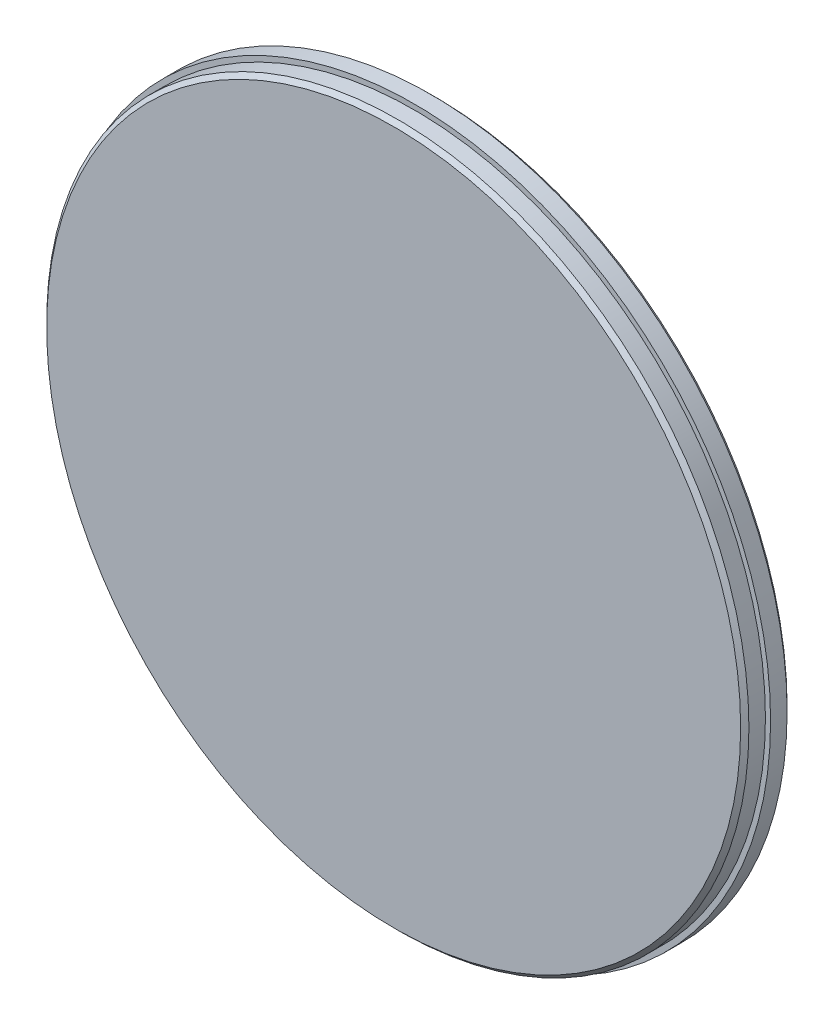
ISO-10303-21;
HEADER;
FILE_DESCRIPTION(('STEP AP214'),'2;1');
FILE_NAME('part.step','',(''),(''),'','','');
FILE_SCHEMA(('AUTOMOTIVE_DESIGN { 1 0 10303 214 1 1 1 1 }'));
ENDSEC;
DATA;
#1=APPLICATION_CONTEXT('core data for automotive mechanical design processes');
#2=APPLICATION_PROTOCOL_DEFINITION('international standard','automotive_design',2000,#1);
#3=PRODUCT_CONTEXT('',#1,'mechanical');
#4=PRODUCT('Part','Part','',(#3));
#5=PRODUCT_RELATED_PRODUCT_CATEGORY('part','',(#4));
#6=PRODUCT_DEFINITION_FORMATION('','',#4);
#7=PRODUCT_DEFINITION_CONTEXT('part definition',#1,'design');
#8=PRODUCT_DEFINITION('design','',#6,#7);
#9=PRODUCT_DEFINITION_SHAPE('','',#8);
#10=(LENGTH_UNIT() NAMED_UNIT(*) SI_UNIT(.MILLI.,.METRE.));
#11=(NAMED_UNIT(*) PLANE_ANGLE_UNIT() SI_UNIT($,.RADIAN.));
#12=(NAMED_UNIT(*) SI_UNIT($,.STERADIAN.) SOLID_ANGLE_UNIT());
#13=UNCERTAINTY_MEASURE_WITH_UNIT(LENGTH_MEASURE(1.E-05),#10,'distance_accuracy_value','');
#14=(GEOMETRIC_REPRESENTATION_CONTEXT(3) GLOBAL_UNCERTAINTY_ASSIGNED_CONTEXT((#13)) GLOBAL_UNIT_ASSIGNED_CONTEXT((#10,
#11,#12)) REPRESENTATION_CONTEXT('',''));
#15=CARTESIAN_POINT('',(0.,0.,0.));
#16=DIRECTION('',(0.,0.,1.));
#17=DIRECTION('',(1.,0.,0.));
#18=AXIS2_PLACEMENT_3D('',#15,#16,#17);
#19=CARTESIAN_POINT('',(0.,0.,1.));
#20=DIRECTION('',(0.,0.,1.));
#21=DIRECTION('',(1.,0.,0.));
#22=AXIS2_PLACEMENT_3D('',#19,#20,#21);
#23=PLANE('',#22);
#24=CARTESIAN_POINT('',(0.,0.,1.));
#25=DIRECTION('',(0.,0.,1.));
#26=DIRECTION('',(1.,0.,0.));
#27=AXIS2_PLACEMENT_3D('',#24,#25,#26);
#28=CIRCLE('',#27,17.25);
#29=CARTESIAN_POINT('',(17.25,0.,1.));
#30=VERTEX_POINT('',#29);
#31=EDGE_CURVE('E64',#30,#30,#28,.T.);
#32=ORIENTED_EDGE('',*,*,#31,.T.);
#33=EDGE_LOOP('',(#32));
#34=FACE_BOUND('',#33,.T.);
#35=CARTESIAN_POINT('',(0.,0.,1.));
#36=DIRECTION('',(0.,0.,1.));
#37=DIRECTION('',(1.,0.,0.));
#38=AXIS2_PLACEMENT_3D('',#35,#36,#37);
#39=CIRCLE('',#38,17.);
#40=CARTESIAN_POINT('',(17.,0.,1.));
#41=VERTEX_POINT('',#40);
#42=EDGE_CURVE('E68',#41,#41,#39,.T.);
#43=ORIENTED_EDGE('',*,*,#42,.F.);
#44=EDGE_LOOP('',(#43));
#45=FACE_BOUND('',#44,.T.);
#46=ADVANCED_FACE('F39',(#34,#45),#23,.T.);
#47=CARTESIAN_POINT('',(0.,0.,0.));
#48=DIRECTION('',(0.,0.,1.));
#49=DIRECTION('',(1.,0.,0.));
#50=AXIS2_PLACEMENT_3D('',#47,#48,#49);
#51=PLANE('',#50);
#52=CARTESIAN_POINT('',(0.,0.,0.));
#53=DIRECTION('',(0.,0.,1.));
#54=DIRECTION('',(1.,0.,0.));
#55=AXIS2_PLACEMENT_3D('',#52,#53,#54);
#56=CIRCLE('',#55,17.05);
#57=CARTESIAN_POINT('',(17.05,0.,0.));
#58=VERTEX_POINT('',#57);
#59=EDGE_CURVE('E53',#58,#58,#56,.F.);
#60=ORIENTED_EDGE('',*,*,#59,.T.);
#61=EDGE_LOOP('',(#60));
#62=FACE_BOUND('',#61,.T.);
#63=ADVANCED_FACE('F76',(#62),#51,.F.);
#64=CARTESIAN_POINT('',(0.,0.,1.));
#65=DIRECTION('',(0.,0.,-1.));
#66=DIRECTION('',(-1.,0.,0.));
#67=AXIS2_PLACEMENT_3D('',#64,#65,#66);
#68=CYLINDRICAL_SURFACE('',#67,17.25);
#69=CARTESIAN_POINT('',(0.,0.,0.200000000000006));
#70=DIRECTION('',(0.,0.,1.));
#71=DIRECTION('',(1.,0.,0.));
#72=AXIS2_PLACEMENT_3D('',#69,#70,#71);
#73=CIRCLE('',#72,17.25);
#74=CARTESIAN_POINT('',(17.25,0.,0.200000000000006));
#75=VERTEX_POINT('',#74);
#76=EDGE_CURVE('E58',#75,#75,#73,.T.);
#77=ORIENTED_EDGE('',*,*,#76,.T.);
#78=EDGE_LOOP('',(#77));
#79=FACE_BOUND('',#78,.T.);
#80=ORIENTED_EDGE('',*,*,#31,.F.);
#81=EDGE_LOOP('',(#80));
#82=FACE_BOUND('',#81,.T.);
#83=ADVANCED_FACE('F82',(#79,#82),#68,.T.);
#84=CARTESIAN_POINT('',(0.,0.,2.));
#85=DIRECTION('',(0.,0.,-1.));
#86=DIRECTION('',(-1.,0.,0.));
#87=AXIS2_PLACEMENT_3D('',#84,#85,#86);
#88=CYLINDRICAL_SURFACE('',#87,17.);
#89=CARTESIAN_POINT('',(0.,0.,1.8));
#90=DIRECTION('',(0.,0.,1.));
#91=DIRECTION('',(1.,0.,0.));
#92=AXIS2_PLACEMENT_3D('',#89,#90,#91);
#93=CIRCLE('',#92,17.);
#94=CARTESIAN_POINT('',(17.,0.,1.8));
#95=VERTEX_POINT('',#94);
#96=EDGE_CURVE('E10',#95,#95,#93,.F.);
#97=ORIENTED_EDGE('',*,*,#96,.T.);
#98=EDGE_LOOP('',(#97));
#99=FACE_BOUND('',#98,.T.);
#100=ORIENTED_EDGE('',*,*,#42,.T.);
#101=EDGE_LOOP('',(#100));
#102=FACE_BOUND('',#101,.T.);
#103=ADVANCED_FACE('F73',(#99,#102),#88,.T.);
#104=CARTESIAN_POINT('',(0.,0.,2.));
#105=DIRECTION('',(0.,0.,1.));
#106=DIRECTION('',(1.,0.,0.));
#107=AXIS2_PLACEMENT_3D('',#104,#105,#106);
#108=PLANE('',#107);
#109=CARTESIAN_POINT('',(0.,0.,2.));
#110=DIRECTION('',(0.,0.,1.));
#111=DIRECTION('',(1.,0.,0.));
#112=AXIS2_PLACEMENT_3D('',#109,#110,#111);
#113=CIRCLE('',#112,16.8);
#114=CARTESIAN_POINT('',(16.8,0.,2.));
#115=VERTEX_POINT('',#114);
#116=EDGE_CURVE('E48',#115,#115,#113,.T.);
#117=ORIENTED_EDGE('',*,*,#116,.T.);
#118=EDGE_LOOP('',(#117));
#119=FACE_BOUND('',#118,.T.);
#120=ADVANCED_FACE('F95',(#119),#108,.T.);
#121=CARTESIAN_POINT('',(0.,0.,0.200000000000006));
#122=DIRECTION('',(0.,0.,1.));
#123=DIRECTION('',(1.,0.,0.));
#124=AXIS2_PLACEMENT_3D('',#121,#122,#123);
#125=CONICAL_SURFACE('',#124,17.25,0.785398163397457);
#126=ORIENTED_EDGE('',*,*,#59,.F.);
#127=EDGE_LOOP('',(#126));
#128=FACE_BOUND('',#127,.T.);
#129=ORIENTED_EDGE('',*,*,#76,.F.);
#130=EDGE_LOOP('',(#129));
#131=FACE_BOUND('',#130,.T.);
#132=ADVANCED_FACE('F91',(#128,#131),#125,.T.);
#133=CARTESIAN_POINT('',(0.,0.,2.));
#134=DIRECTION('',(0.,0.,-1.));
#135=DIRECTION('',(-1.,0.,0.));
#136=AXIS2_PLACEMENT_3D('',#133,#134,#135);
#137=CONICAL_SURFACE('',#136,16.8,0.785398163397457);
#138=ORIENTED_EDGE('',*,*,#96,.F.);
#139=EDGE_LOOP('',(#138));
#140=FACE_BOUND('',#139,.T.);
#141=ORIENTED_EDGE('',*,*,#116,.F.);
#142=EDGE_LOOP('',(#141));
#143=FACE_BOUND('',#142,.T.);
#144=ADVANCED_FACE('F42',(#140,#143),#137,.T.);
#145=CLOSED_SHELL('',(#46,#63,#83,#103,#120,#132,#144));
#146=MANIFOLD_SOLID_BREP('B2',#145);
#147=ADVANCED_BREP_SHAPE_REPRESENTATION('',(#18,#146),#14);
#148=SHAPE_DEFINITION_REPRESENTATION(#9,#147);
ENDSEC;
END-ISO-10303-21;
